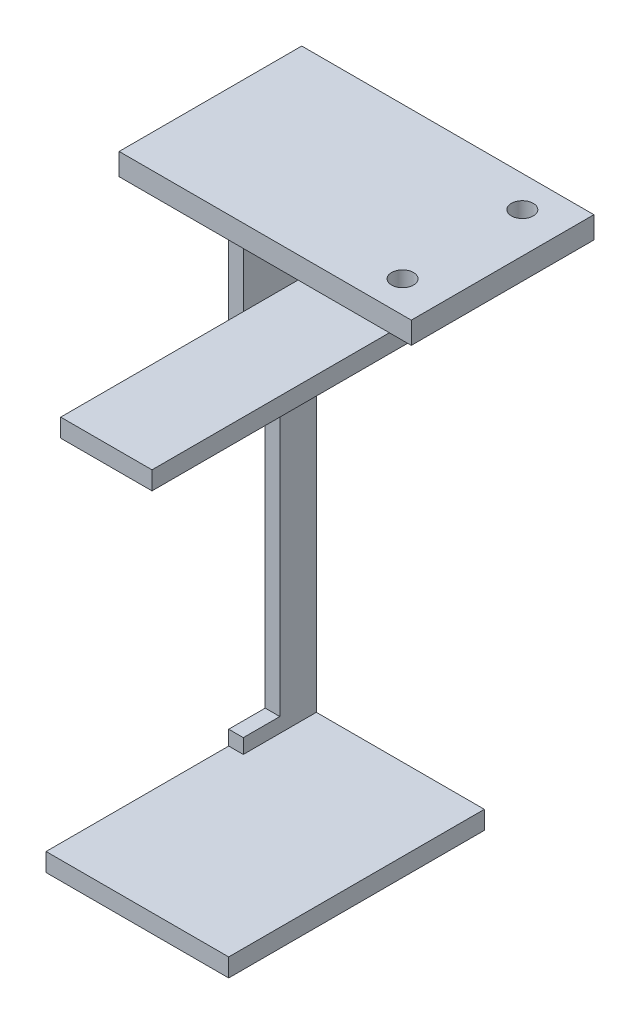
ISO-10303-21;
HEADER;
FILE_DESCRIPTION(('STEP AP214'),'2;1');
FILE_NAME('part.step','',(''),(''),'','','');
FILE_SCHEMA(('AUTOMOTIVE_DESIGN { 1 0 10303 214 1 1 1 1 }'));
ENDSEC;
DATA;
#1=APPLICATION_CONTEXT('core data for automotive mechanical design processes');
#2=APPLICATION_PROTOCOL_DEFINITION('international standard','automotive_design',2000,#1);
#3=PRODUCT_CONTEXT('',#1,'mechanical');
#4=PRODUCT('Part','Part','',(#3));
#5=PRODUCT_RELATED_PRODUCT_CATEGORY('part','',(#4));
#6=PRODUCT_DEFINITION_FORMATION('','',#4);
#7=PRODUCT_DEFINITION_CONTEXT('part definition',#1,'design');
#8=PRODUCT_DEFINITION('design','',#6,#7);
#9=PRODUCT_DEFINITION_SHAPE('','',#8);
#10=(LENGTH_UNIT() NAMED_UNIT(*) SI_UNIT(.MILLI.,.METRE.));
#11=(NAMED_UNIT(*) PLANE_ANGLE_UNIT() SI_UNIT($,.RADIAN.));
#12=(NAMED_UNIT(*) SI_UNIT($,.STERADIAN.) SOLID_ANGLE_UNIT());
#13=UNCERTAINTY_MEASURE_WITH_UNIT(LENGTH_MEASURE(1.E-05),#10,'distance_accuracy_value','');
#14=(GEOMETRIC_REPRESENTATION_CONTEXT(3) GLOBAL_UNCERTAINTY_ASSIGNED_CONTEXT((#13)) GLOBAL_UNIT_ASSIGNED_CONTEXT((#10,
#11,#12)) REPRESENTATION_CONTEXT('',''));
#15=CARTESIAN_POINT('',(0.,0.,0.));
#16=DIRECTION('',(0.,0.,1.));
#17=DIRECTION('',(1.,0.,0.));
#18=AXIS2_PLACEMENT_3D('',#15,#16,#17);
#19=CARTESIAN_POINT('',(-40.,-75.,-15.));
#20=DIRECTION('',(0.,0.,-1.));
#21=DIRECTION('',(-1.,0.,0.));
#22=AXIS2_PLACEMENT_3D('',#19,#20,#21);
#23=PLANE('',#22);
#24=DIRECTION('',(0.,1.,0.));
#25=VECTOR('',#24,1.);
#26=CARTESIAN_POINT('',(-40.,-75.,-15.));
#27=LINE('',#26,#25);
#28=CARTESIAN_POINT('',(-40.,-27.,-15.));
#29=VERTEX_POINT('',#28);
#30=CARTESIAN_POINT('',(-40.,0.,-15.));
#31=VERTEX_POINT('',#30);
#32=EDGE_CURVE('E307',#29,#31,#27,.T.);
#33=ORIENTED_EDGE('',*,*,#32,.F.);
#34=DIRECTION('',(1.,0.,0.));
#35=VECTOR('',#34,1.);
#36=CARTESIAN_POINT('',(-40.,-27.,-15.));
#37=LINE('',#36,#35);
#38=CARTESIAN_POINT('',(-38.,-27.,-15.));
#39=VERTEX_POINT('',#38);
#40=EDGE_CURVE('E213',#29,#39,#37,.T.);
#41=ORIENTED_EDGE('',*,*,#40,.T.);
#42=DIRECTION('',(0.,1.,0.));
#43=VECTOR('',#42,1.);
#44=CARTESIAN_POINT('',(-38.,-75.,-15.));
#45=LINE('',#44,#43);
#46=CARTESIAN_POINT('',(-38.,-25.,-15.));
#47=VERTEX_POINT('',#46);
#48=EDGE_CURVE('E322',#39,#47,#45,.T.);
#49=ORIENTED_EDGE('',*,*,#48,.T.);
#50=CARTESIAN_POINT('',(-38.,-22.5,-15.));
#51=VERTEX_POINT('',#50);
#52=EDGE_CURVE('E323',#47,#51,#45,.T.);
#53=ORIENTED_EDGE('',*,*,#52,.T.);
#54=CARTESIAN_POINT('',(-38.,0.,-15.));
#55=VERTEX_POINT('',#54);
#56=EDGE_CURVE('E316',#51,#55,#45,.T.);
#57=ORIENTED_EDGE('',*,*,#56,.T.);
#58=DIRECTION('',(-1.,0.,0.));
#59=VECTOR('',#58,1.);
#60=CARTESIAN_POINT('',(-40.,0.,-15.));
#61=LINE('',#60,#59);
#62=EDGE_CURVE('E303',#55,#31,#61,.T.);
#63=ORIENTED_EDGE('',*,*,#62,.T.);
#64=EDGE_LOOP('',(#33,#41,#49,#53,#57,#63));
#65=FACE_BOUND('',#64,.T.);
#66=ADVANCED_FACE('F45',(#65),#23,.F.);
#67=CARTESIAN_POINT('',(-38.,-75.,-25.));
#68=DIRECTION('',(-1.,0.,0.));
#69=DIRECTION('',(0.,0.,1.));
#70=AXIS2_PLACEMENT_3D('',#67,#68,#69);
#71=PLANE('',#70);
#72=DIRECTION('',(0.,0.,1.));
#73=VECTOR('',#72,1.);
#74=CARTESIAN_POINT('',(-38.,-22.5,-25.));
#75=LINE('',#74,#73);
#76=CARTESIAN_POINT('',(-38.,-22.5,-25.));
#77=VERTEX_POINT('',#76);
#78=EDGE_CURVE('E69',#77,#51,#75,.T.);
#79=ORIENTED_EDGE('',*,*,#78,.F.);
#80=DIRECTION('',(0.,1.,0.));
#81=VECTOR('',#80,1.);
#82=CARTESIAN_POINT('',(-38.,-75.,-25.));
#83=LINE('',#82,#81);
#84=CARTESIAN_POINT('',(-38.,0.,-25.));
#85=VERTEX_POINT('',#84);
#86=EDGE_CURVE('E321',#77,#85,#83,.T.);
#87=ORIENTED_EDGE('',*,*,#86,.T.);
#88=DIRECTION('',(0.,0.,1.));
#89=VECTOR('',#88,1.);
#90=CARTESIAN_POINT('',(-38.,0.,-25.));
#91=LINE('',#90,#89);
#92=EDGE_CURVE('E297',#85,#55,#91,.T.);
#93=ORIENTED_EDGE('',*,*,#92,.T.);
#94=ORIENTED_EDGE('',*,*,#56,.F.);
#95=EDGE_LOOP('',(#79,#87,#93,#94));
#96=FACE_BOUND('',#95,.T.);
#97=ADVANCED_FACE('F443',(#96),#71,.F.);
#98=ORIENTED_EDGE('',*,*,#48,.F.);
#99=DIRECTION('',(0.,0.,1.));
#100=VECTOR('',#99,1.);
#101=CARTESIAN_POINT('',(-38.,-27.,-15.));
#102=LINE('',#101,#100);
#103=CARTESIAN_POINT('',(-38.,-27.,-20.));
#104=VERTEX_POINT('',#103);
#105=EDGE_CURVE('E201',#104,#39,#102,.T.);
#106=ORIENTED_EDGE('',*,*,#105,.F.);
#107=DIRECTION('',(0.,1.,0.));
#108=VECTOR('',#107,1.);
#109=CARTESIAN_POINT('',(-38.,-27.,-20.));
#110=LINE('',#109,#108);
#111=CARTESIAN_POINT('',(-38.,-73.,-20.));
#112=VERTEX_POINT('',#111);
#113=EDGE_CURVE('E204',#112,#104,#110,.T.);
#114=ORIENTED_EDGE('',*,*,#113,.F.);
#115=DIRECTION('',(0.,0.,-1.));
#116=VECTOR('',#115,1.);
#117=CARTESIAN_POINT('',(-38.,-73.,-20.));
#118=LINE('',#117,#116);
#119=CARTESIAN_POINT('',(-38.,-73.,-15.));
#120=VERTEX_POINT('',#119);
#121=EDGE_CURVE('E179',#120,#112,#118,.T.);
#122=ORIENTED_EDGE('',*,*,#121,.F.);
#123=CARTESIAN_POINT('',(-38.,-75.,-15.));
#124=VERTEX_POINT('',#123);
#125=EDGE_CURVE('E317',#124,#120,#45,.T.);
#126=ORIENTED_EDGE('',*,*,#125,.F.);
#127=DIRECTION('',(0.,0.,1.));
#128=VECTOR('',#127,1.);
#129=CARTESIAN_POINT('',(-38.,-75.,-25.));
#130=LINE('',#129,#128);
#131=CARTESIAN_POINT('',(-38.,-75.,-25.));
#132=VERTEX_POINT('',#131);
#133=EDGE_CURVE('E298',#132,#124,#130,.T.);
#134=ORIENTED_EDGE('',*,*,#133,.F.);
#135=CARTESIAN_POINT('',(-38.,-25.,-25.));
#136=VERTEX_POINT('',#135);
#137=EDGE_CURVE('E324',#132,#136,#83,.T.);
#138=ORIENTED_EDGE('',*,*,#137,.T.);
#139=DIRECTION('',(0.,0.,-1.));
#140=VECTOR('',#139,1.);
#141=CARTESIAN_POINT('',(-38.,-25.,-25.));
#142=LINE('',#141,#140);
#143=EDGE_CURVE('E242',#47,#136,#142,.T.);
#144=ORIENTED_EDGE('',*,*,#143,.F.);
#145=EDGE_LOOP('',(#98,#106,#114,#122,#126,#134,#138,#144));
#146=FACE_BOUND('',#145,.T.);
#147=ADVANCED_FACE('F407',(#146),#71,.F.);
#148=CARTESIAN_POINT('',(0.,0.,0.));
#149=DIRECTION('',(0.,1.,0.));
#150=DIRECTION('',(0.,0.,1.));
#151=AXIS2_PLACEMENT_3D('',#148,#149,#150);
#152=PLANE('',#151);
#153=CARTESIAN_POINT('',(-5.5,0.,-4.3));
#154=DIRECTION('',(0.,1.,0.));
#155=DIRECTION('',(0.,0.,1.));
#156=AXIS2_PLACEMENT_3D('',#153,#154,#155);
#157=CIRCLE('',#156,1.5);
#158=CARTESIAN_POINT('',(-5.5,0.,-2.8));
#159=VERTEX_POINT('',#158);
#160=EDGE_CURVE('E328',#159,#159,#157,.T.);
#161=ORIENTED_EDGE('',*,*,#160,.T.);
#162=EDGE_LOOP('',(#161));
#163=FACE_BOUND('',#162,.T.);
#164=CARTESIAN_POINT('',(-5.5,0.,-20.7));
#165=DIRECTION('',(0.,1.,0.));
#166=DIRECTION('',(0.,0.,1.));
#167=AXIS2_PLACEMENT_3D('',#164,#165,#166);
#168=CIRCLE('',#167,1.5);
#169=CARTESIAN_POINT('',(-5.5,0.,-19.2));
#170=VERTEX_POINT('',#169);
#171=EDGE_CURVE('E333',#170,#170,#168,.T.);
#172=ORIENTED_EDGE('',*,*,#171,.T.);
#173=EDGE_LOOP('',(#172));
#174=FACE_BOUND('',#173,.T.);
#175=ORIENTED_EDGE('',*,*,#62,.F.);
#176=ORIENTED_EDGE('',*,*,#92,.F.);
#177=DIRECTION('',(-1.,0.,0.));
#178=VECTOR('',#177,1.);
#179=CARTESIAN_POINT('',(0.,0.,-25.));
#180=LINE('',#179,#178);
#181=CARTESIAN_POINT('',(0.,0.,-25.));
#182=VERTEX_POINT('',#181);
#183=EDGE_CURVE('E363',#182,#85,#180,.T.);
#184=ORIENTED_EDGE('',*,*,#183,.F.);
#185=DIRECTION('',(0.,0.,-1.));
#186=VECTOR('',#185,1.);
#187=CARTESIAN_POINT('',(0.,0.,0.));
#188=LINE('',#187,#186);
#189=CARTESIAN_POINT('',(0.,0.,0.));
#190=VERTEX_POINT('',#189);
#191=EDGE_CURVE('E341',#190,#182,#188,.T.);
#192=ORIENTED_EDGE('',*,*,#191,.F.);
#193=DIRECTION('',(1.,0.,0.));
#194=VECTOR('',#193,1.);
#195=CARTESIAN_POINT('',(0.,0.,0.));
#196=LINE('',#195,#194);
#197=CARTESIAN_POINT('',(-40.,0.,0.));
#198=VERTEX_POINT('',#197);
#199=EDGE_CURVE('E350',#198,#190,#196,.T.);
#200=ORIENTED_EDGE('',*,*,#199,.F.);
#201=DIRECTION('',(0.,0.,1.));
#202=VECTOR('',#201,1.);
#203=CARTESIAN_POINT('',(-40.,0.,0.));
#204=LINE('',#203,#202);
#205=EDGE_CURVE('E367',#31,#198,#204,.T.);
#206=ORIENTED_EDGE('',*,*,#205,.F.);
#207=EDGE_LOOP('',(#175,#176,#184,#192,#200,#206));
#208=FACE_BOUND('',#207,.T.);
#209=ADVANCED_FACE('F449',(#163,#174,#208),#152,.F.);
#210=CARTESIAN_POINT('',(0.,3.,0.));
#211=DIRECTION('',(0.,1.,0.));
#212=DIRECTION('',(0.,0.,1.));
#213=AXIS2_PLACEMENT_3D('',#210,#211,#212);
#214=PLANE('',#213);
#215=CARTESIAN_POINT('',(-5.5,3.,-20.7));
#216=DIRECTION('',(0.,1.,0.));
#217=DIRECTION('',(0.,0.,1.));
#218=AXIS2_PLACEMENT_3D('',#215,#216,#217);
#219=CIRCLE('',#218,1.5);
#220=CARTESIAN_POINT('',(-5.5,3.,-19.2));
#221=VERTEX_POINT('',#220);
#222=EDGE_CURVE('E337',#221,#221,#219,.T.);
#223=ORIENTED_EDGE('',*,*,#222,.F.);
#224=EDGE_LOOP('',(#223));
#225=FACE_BOUND('',#224,.T.);
#226=DIRECTION('',(0.,0.,-1.));
#227=VECTOR('',#226,1.);
#228=CARTESIAN_POINT('',(0.,3.,0.));
#229=LINE('',#228,#227);
#230=CARTESIAN_POINT('',(0.,3.,0.));
#231=VERTEX_POINT('',#230);
#232=CARTESIAN_POINT('',(0.,3.,-25.));
#233=VERTEX_POINT('',#232);
#234=EDGE_CURVE('E345',#231,#233,#229,.T.);
#235=ORIENTED_EDGE('',*,*,#234,.T.);
#236=DIRECTION('',(-1.,0.,0.));
#237=VECTOR('',#236,1.);
#238=CARTESIAN_POINT('',(0.,3.,-25.));
#239=LINE('',#238,#237);
#240=CARTESIAN_POINT('',(-40.,3.,-25.));
#241=VERTEX_POINT('',#240);
#242=EDGE_CURVE('E349',#233,#241,#239,.T.);
#243=ORIENTED_EDGE('',*,*,#242,.T.);
#244=DIRECTION('',(0.,0.,1.));
#245=VECTOR('',#244,1.);
#246=CARTESIAN_POINT('',(-40.,3.,0.));
#247=LINE('',#246,#245);
#248=CARTESIAN_POINT('',(-40.,3.,0.));
#249=VERTEX_POINT('',#248);
#250=EDGE_CURVE('E353',#241,#249,#247,.T.);
#251=ORIENTED_EDGE('',*,*,#250,.T.);
#252=DIRECTION('',(1.,0.,0.));
#253=VECTOR('',#252,1.);
#254=CARTESIAN_POINT('',(0.,3.,0.));
#255=LINE('',#254,#253);
#256=EDGE_CURVE('E356',#249,#231,#255,.T.);
#257=ORIENTED_EDGE('',*,*,#256,.T.);
#258=EDGE_LOOP('',(#235,#243,#251,#257));
#259=FACE_BOUND('',#258,.T.);
#260=CARTESIAN_POINT('',(-5.5,3.,-4.3));
#261=DIRECTION('',(0.,1.,0.));
#262=DIRECTION('',(0.,0.,1.));
#263=AXIS2_PLACEMENT_3D('',#260,#261,#262);
#264=CIRCLE('',#263,1.5);
#265=CARTESIAN_POINT('',(-5.5,3.,-2.8));
#266=VERTEX_POINT('',#265);
#267=EDGE_CURVE('E329',#266,#266,#264,.T.);
#268=ORIENTED_EDGE('',*,*,#267,.F.);
#269=EDGE_LOOP('',(#268));
#270=FACE_BOUND('',#269,.T.);
#271=ADVANCED_FACE('F458',(#225,#259,#270),#214,.T.);
#272=CARTESIAN_POINT('',(0.,3.,0.));
#273=DIRECTION('',(-1.,0.,0.));
#274=DIRECTION('',(0.,0.,1.));
#275=AXIS2_PLACEMENT_3D('',#272,#273,#274);
#276=PLANE('',#275);
#277=ORIENTED_EDGE('',*,*,#191,.T.);
#278=DIRECTION('',(0.,-1.,0.));
#279=VECTOR('',#278,1.);
#280=CARTESIAN_POINT('',(0.,3.,-25.));
#281=LINE('',#280,#279);
#282=EDGE_CURVE('E11',#233,#182,#281,.T.);
#283=ORIENTED_EDGE('',*,*,#282,.F.);
#284=ORIENTED_EDGE('',*,*,#234,.F.);
#285=DIRECTION('',(0.,-1.,0.));
#286=VECTOR('',#285,1.);
#287=CARTESIAN_POINT('',(0.,3.,0.));
#288=LINE('',#287,#286);
#289=EDGE_CURVE('E359',#231,#190,#288,.T.);
#290=ORIENTED_EDGE('',*,*,#289,.T.);
#291=EDGE_LOOP('',(#277,#283,#284,#290));
#292=FACE_BOUND('',#291,.T.);
#293=ADVANCED_FACE('F47',(#292),#276,.F.);
#294=CARTESIAN_POINT('',(0.,3.,-25.));
#295=DIRECTION('',(0.,0.,1.));
#296=DIRECTION('',(1.,0.,0.));
#297=AXIS2_PLACEMENT_3D('',#294,#295,#296);
#298=PLANE('',#297);
#299=ORIENTED_EDGE('',*,*,#183,.T.);
#300=ORIENTED_EDGE('',*,*,#86,.F.);
#301=DIRECTION('',(-1.,0.,0.));
#302=VECTOR('',#301,1.);
#303=CARTESIAN_POINT('',(-25.5,-22.5,-25.));
#304=LINE('',#303,#302);
#305=CARTESIAN_POINT('',(-25.5,-22.5,-25.));
#306=VERTEX_POINT('',#305);
#307=EDGE_CURVE('E257',#306,#77,#304,.T.);
#308=ORIENTED_EDGE('',*,*,#307,.F.);
#309=DIRECTION('',(0.,1.,0.));
#310=VECTOR('',#309,1.);
#311=CARTESIAN_POINT('',(-25.5,-25.,-25.));
#312=LINE('',#311,#310);
#313=CARTESIAN_POINT('',(-25.5,-25.,-25.));
#314=VERTEX_POINT('',#313);
#315=EDGE_CURVE('E222',#314,#306,#312,.T.);
#316=ORIENTED_EDGE('',*,*,#315,.F.);
#317=DIRECTION('',(-1.,0.,0.));
#318=VECTOR('',#317,1.);
#319=CARTESIAN_POINT('',(-25.5,-25.,-25.));
#320=LINE('',#319,#318);
#321=EDGE_CURVE('E236',#314,#136,#320,.T.);
#322=ORIENTED_EDGE('',*,*,#321,.T.);
#323=ORIENTED_EDGE('',*,*,#137,.F.);
#324=DIRECTION('',(1.,0.,0.));
#325=VECTOR('',#324,1.);
#326=CARTESIAN_POINT('',(-40.,-75.,-25.));
#327=LINE('',#326,#325);
#328=CARTESIAN_POINT('',(-15.,-75.,-25.));
#329=VERTEX_POINT('',#328);
#330=EDGE_CURVE('E278',#132,#329,#327,.T.);
#331=ORIENTED_EDGE('',*,*,#330,.T.);
#332=DIRECTION('',(0.,1.,0.));
#333=VECTOR('',#332,1.);
#334=CARTESIAN_POINT('',(-15.,-77.5,-25.));
#335=LINE('',#334,#333);
#336=CARTESIAN_POINT('',(-15.,-77.5,-25.));
#337=VERTEX_POINT('',#336);
#338=EDGE_CURVE('E293',#337,#329,#335,.T.);
#339=ORIENTED_EDGE('',*,*,#338,.F.);
#340=DIRECTION('',(1.,0.,0.));
#341=VECTOR('',#340,1.);
#342=CARTESIAN_POINT('',(-40.,-77.5,-25.));
#343=LINE('',#342,#341);
#344=CARTESIAN_POINT('',(-40.,-77.5,-25.));
#345=VERTEX_POINT('',#344);
#346=EDGE_CURVE('E265',#345,#337,#343,.T.);
#347=ORIENTED_EDGE('',*,*,#346,.F.);
#348=DIRECTION('',(0.,-1.,0.));
#349=VECTOR('',#348,1.);
#350=CARTESIAN_POINT('',(-40.,3.,-25.));
#351=LINE('',#350,#349);
#352=EDGE_CURVE('E54',#241,#345,#351,.T.);
#353=ORIENTED_EDGE('',*,*,#352,.F.);
#354=ORIENTED_EDGE('',*,*,#242,.F.);
#355=ORIENTED_EDGE('',*,*,#282,.T.);
#356=EDGE_LOOP('',(#299,#300,#308,#316,#322,#323,#331,#339,#347,#353,#354,#355));
#357=FACE_BOUND('',#356,.T.);
#358=ADVANCED_FACE('F386',(#357),#298,.F.);
#359=CARTESIAN_POINT('',(-40.,3.,0.));
#360=DIRECTION('',(1.,0.,0.));
#361=DIRECTION('',(0.,0.,-1.));
#362=AXIS2_PLACEMENT_3D('',#359,#360,#361);
#363=PLANE('',#362);
#364=DIRECTION('',(0.,1.,0.));
#365=VECTOR('',#364,1.);
#366=CARTESIAN_POINT('',(-40.,-27.,-20.));
#367=LINE('',#366,#365);
#368=CARTESIAN_POINT('',(-40.,-73.,-20.));
#369=VERTEX_POINT('',#368);
#370=CARTESIAN_POINT('',(-40.,-27.,-20.));
#371=VERTEX_POINT('',#370);
#372=EDGE_CURVE('E188',#369,#371,#367,.T.);
#373=ORIENTED_EDGE('',*,*,#372,.T.);
#374=DIRECTION('',(0.,0.,1.));
#375=VECTOR('',#374,1.);
#376=CARTESIAN_POINT('',(-40.,-27.,-15.));
#377=LINE('',#376,#375);
#378=EDGE_CURVE('E194',#371,#29,#377,.T.);
#379=ORIENTED_EDGE('',*,*,#378,.T.);
#380=ORIENTED_EDGE('',*,*,#32,.T.);
#381=ORIENTED_EDGE('',*,*,#205,.T.);
#382=DIRECTION('',(0.,-1.,0.));
#383=VECTOR('',#382,1.);
#384=CARTESIAN_POINT('',(-40.,3.,0.));
#385=LINE('',#384,#383);
#386=EDGE_CURVE('E375',#249,#198,#385,.T.);
#387=ORIENTED_EDGE('',*,*,#386,.F.);
#388=ORIENTED_EDGE('',*,*,#250,.F.);
#389=ORIENTED_EDGE('',*,*,#352,.T.);
#390=DIRECTION('',(0.,0.,-1.));
#391=VECTOR('',#390,1.);
#392=CARTESIAN_POINT('',(-40.,-77.5,-25.));
#393=LINE('',#392,#391);
#394=CARTESIAN_POINT('',(-40.,-77.5,10.));
#395=VERTEX_POINT('',#394);
#396=EDGE_CURVE('E261',#395,#345,#393,.T.);
#397=ORIENTED_EDGE('',*,*,#396,.F.);
#398=DIRECTION('',(0.,1.,0.));
#399=VECTOR('',#398,1.);
#400=CARTESIAN_POINT('',(-40.,-77.5,10.));
#401=LINE('',#400,#399);
#402=CARTESIAN_POINT('',(-40.,-75.,10.));
#403=VERTEX_POINT('',#402);
#404=EDGE_CURVE('E275',#395,#403,#401,.T.);
#405=ORIENTED_EDGE('',*,*,#404,.T.);
#406=DIRECTION('',(0.,0.,-1.));
#407=VECTOR('',#406,1.);
#408=CARTESIAN_POINT('',(-40.,-75.,-25.));
#409=LINE('',#408,#407);
#410=CARTESIAN_POINT('',(-40.,-75.,-15.));
#411=VERTEX_POINT('',#410);
#412=EDGE_CURVE('E260',#403,#411,#409,.T.);
#413=ORIENTED_EDGE('',*,*,#412,.T.);
#414=CARTESIAN_POINT('',(-40.,-73.,-15.));
#415=VERTEX_POINT('',#414);
#416=EDGE_CURVE('E199',#411,#415,#27,.T.);
#417=ORIENTED_EDGE('',*,*,#416,.T.);
#418=DIRECTION('',(0.,0.,-1.));
#419=VECTOR('',#418,1.);
#420=CARTESIAN_POINT('',(-40.,-73.,-20.));
#421=LINE('',#420,#419);
#422=EDGE_CURVE('E61',#415,#369,#421,.T.);
#423=ORIENTED_EDGE('',*,*,#422,.T.);
#424=EDGE_LOOP('',(#373,#379,#380,#381,#387,#388,#389,#397,#405,#413,#417,#423));
#425=FACE_BOUND('',#424,.T.);
#426=ADVANCED_FACE('F197',(#425),#363,.F.);
#427=CARTESIAN_POINT('',(0.,3.,0.));
#428=DIRECTION('',(0.,0.,-1.));
#429=DIRECTION('',(-1.,0.,0.));
#430=AXIS2_PLACEMENT_3D('',#427,#428,#429);
#431=PLANE('',#430);
#432=ORIENTED_EDGE('',*,*,#199,.T.);
#433=ORIENTED_EDGE('',*,*,#289,.F.);
#434=ORIENTED_EDGE('',*,*,#256,.F.);
#435=ORIENTED_EDGE('',*,*,#386,.T.);
#436=EDGE_LOOP('',(#432,#433,#434,#435));
#437=FACE_BOUND('',#436,.T.);
#438=ADVANCED_FACE('F454',(#437),#431,.F.);
#439=CARTESIAN_POINT('',(-5.5,3.,-20.7));
#440=DIRECTION('',(0.,-1.,0.));
#441=DIRECTION('',(0.,0.,-1.));
#442=AXIS2_PLACEMENT_3D('',#439,#440,#441);
#443=CYLINDRICAL_SURFACE('',#442,1.5);
#444=ORIENTED_EDGE('',*,*,#222,.T.);
#445=EDGE_LOOP('',(#444));
#446=FACE_BOUND('',#445,.T.);
#447=ORIENTED_EDGE('',*,*,#171,.F.);
#448=EDGE_LOOP('',(#447));
#449=FACE_BOUND('',#448,.T.);
#450=ADVANCED_FACE('F489',(#446,#449),#443,.F.);
#451=CARTESIAN_POINT('',(-5.5,3.,-4.3));
#452=DIRECTION('',(0.,-1.,0.));
#453=DIRECTION('',(0.,0.,-1.));
#454=AXIS2_PLACEMENT_3D('',#451,#452,#453);
#455=CYLINDRICAL_SURFACE('',#454,1.5);
#456=ORIENTED_EDGE('',*,*,#267,.T.);
#457=EDGE_LOOP('',(#456));
#458=FACE_BOUND('',#457,.T.);
#459=ORIENTED_EDGE('',*,*,#160,.F.);
#460=EDGE_LOOP('',(#459));
#461=FACE_BOUND('',#460,.T.);
#462=ADVANCED_FACE('F481',(#458,#461),#455,.F.);
#463=ORIENTED_EDGE('',*,*,#125,.T.);
#464=DIRECTION('',(1.,0.,0.));
#465=VECTOR('',#464,1.);
#466=CARTESIAN_POINT('',(-40.,-73.,-15.));
#467=LINE('',#466,#465);
#468=EDGE_CURVE('E185',#415,#120,#467,.T.);
#469=ORIENTED_EDGE('',*,*,#468,.F.);
#470=ORIENTED_EDGE('',*,*,#416,.F.);
#471=DIRECTION('',(-1.,0.,0.));
#472=VECTOR('',#471,1.);
#473=CARTESIAN_POINT('',(-40.,-75.,-15.));
#474=LINE('',#473,#472);
#475=EDGE_CURVE('E302',#124,#411,#474,.T.);
#476=ORIENTED_EDGE('',*,*,#475,.F.);
#477=EDGE_LOOP('',(#463,#469,#470,#476));
#478=FACE_BOUND('',#477,.T.);
#479=ADVANCED_FACE('F404',(#478),#23,.F.);
#480=CARTESIAN_POINT('',(-15.,-77.5,-25.));
#481=DIRECTION('',(-1.,0.,0.));
#482=DIRECTION('',(0.,0.,1.));
#483=AXIS2_PLACEMENT_3D('',#480,#481,#482);
#484=PLANE('',#483);
#485=DIRECTION('',(0.,0.,1.));
#486=VECTOR('',#485,1.);
#487=CARTESIAN_POINT('',(-15.,-75.,-25.));
#488=LINE('',#487,#486);
#489=CARTESIAN_POINT('',(-15.,-75.,10.));
#490=VERTEX_POINT('',#489);
#491=EDGE_CURVE('E281',#329,#490,#488,.T.);
#492=ORIENTED_EDGE('',*,*,#491,.T.);
#493=DIRECTION('',(0.,1.,0.));
#494=VECTOR('',#493,1.);
#495=CARTESIAN_POINT('',(-15.,-77.5,10.));
#496=LINE('',#495,#494);
#497=CARTESIAN_POINT('',(-15.,-77.5,10.));
#498=VERTEX_POINT('',#497);
#499=EDGE_CURVE('E289',#498,#490,#496,.T.);
#500=ORIENTED_EDGE('',*,*,#499,.F.);
#501=DIRECTION('',(0.,0.,1.));
#502=VECTOR('',#501,1.);
#503=CARTESIAN_POINT('',(-15.,-77.5,-25.));
#504=LINE('',#503,#502);
#505=EDGE_CURVE('E269',#337,#498,#504,.T.);
#506=ORIENTED_EDGE('',*,*,#505,.F.);
#507=ORIENTED_EDGE('',*,*,#338,.T.);
#508=EDGE_LOOP('',(#492,#500,#506,#507));
#509=FACE_BOUND('',#508,.T.);
#510=ADVANCED_FACE('F480',(#509),#484,.F.);
#511=CARTESIAN_POINT('',(-40.,-77.5,10.));
#512=DIRECTION('',(0.,0.,-1.));
#513=DIRECTION('',(-1.,0.,0.));
#514=AXIS2_PLACEMENT_3D('',#511,#512,#513);
#515=PLANE('',#514);
#516=DIRECTION('',(-1.,0.,0.));
#517=VECTOR('',#516,1.);
#518=CARTESIAN_POINT('',(-40.,-75.,10.));
#519=LINE('',#518,#517);
#520=EDGE_CURVE('E266',#490,#403,#519,.T.);
#521=ORIENTED_EDGE('',*,*,#520,.T.);
#522=ORIENTED_EDGE('',*,*,#404,.F.);
#523=DIRECTION('',(-1.,0.,0.));
#524=VECTOR('',#523,1.);
#525=CARTESIAN_POINT('',(-40.,-77.5,10.));
#526=LINE('',#525,#524);
#527=EDGE_CURVE('E272',#498,#395,#526,.T.);
#528=ORIENTED_EDGE('',*,*,#527,.F.);
#529=ORIENTED_EDGE('',*,*,#499,.T.);
#530=EDGE_LOOP('',(#521,#522,#528,#529));
#531=FACE_BOUND('',#530,.T.);
#532=ADVANCED_FACE('F394',(#531),#515,.F.);
#533=CARTESIAN_POINT('',(0.,-77.5,0.));
#534=DIRECTION('',(0.,1.,0.));
#535=DIRECTION('',(0.,0.,1.));
#536=AXIS2_PLACEMENT_3D('',#533,#534,#535);
#537=PLANE('',#536);
#538=ORIENTED_EDGE('',*,*,#396,.T.);
#539=ORIENTED_EDGE('',*,*,#346,.T.);
#540=ORIENTED_EDGE('',*,*,#505,.T.);
#541=ORIENTED_EDGE('',*,*,#527,.T.);
#542=EDGE_LOOP('',(#538,#539,#540,#541));
#543=FACE_BOUND('',#542,.T.);
#544=ADVANCED_FACE('F389',(#543),#537,.F.);
#545=CARTESIAN_POINT('',(0.,-75.,0.));
#546=DIRECTION('',(0.,1.,0.));
#547=DIRECTION('',(0.,0.,1.));
#548=AXIS2_PLACEMENT_3D('',#545,#546,#547);
#549=PLANE('',#548);
#550=ORIENTED_EDGE('',*,*,#330,.F.);
#551=ORIENTED_EDGE('',*,*,#133,.T.);
#552=ORIENTED_EDGE('',*,*,#475,.T.);
#553=ORIENTED_EDGE('',*,*,#412,.F.);
#554=ORIENTED_EDGE('',*,*,#520,.F.);
#555=ORIENTED_EDGE('',*,*,#491,.F.);
#556=EDGE_LOOP('',(#550,#551,#552,#553,#554,#555));
#557=FACE_BOUND('',#556,.T.);
#558=ADVANCED_FACE('F399',(#557),#549,.T.);
#559=CARTESIAN_POINT('',(-38.,0.,0.));
#560=DIRECTION('',(1.,0.,0.));
#561=DIRECTION('',(0.,0.,-1.));
#562=AXIS2_PLACEMENT_3D('',#559,#560,#561);
#563=PLANE('',#562);
#564=CARTESIAN_POINT('',(-38.,-22.5,10.));
#565=VERTEX_POINT('',#564);
#566=EDGE_CURVE('E217',#51,#565,#75,.T.);
#567=ORIENTED_EDGE('',*,*,#566,.F.);
#568=ORIENTED_EDGE('',*,*,#52,.F.);
#569=CARTESIAN_POINT('',(-38.,-25.,10.));
#570=VERTEX_POINT('',#569);
#571=EDGE_CURVE('E227',#570,#47,#142,.T.);
#572=ORIENTED_EDGE('',*,*,#571,.F.);
#573=DIRECTION('',(0.,-1.,0.));
#574=VECTOR('',#573,1.);
#575=CARTESIAN_POINT('',(-38.,-25.,10.));
#576=LINE('',#575,#574);
#577=EDGE_CURVE('E239',#565,#570,#576,.T.);
#578=ORIENTED_EDGE('',*,*,#577,.F.);
#579=EDGE_LOOP('',(#567,#568,#572,#578));
#580=FACE_BOUND('',#579,.T.);
#581=ADVANCED_FACE('F432',(#580),#563,.F.);
#582=CARTESIAN_POINT('',(-25.5,-22.5,-25.));
#583=DIRECTION('',(0.,-1.,0.));
#584=DIRECTION('',(0.,0.,-1.));
#585=AXIS2_PLACEMENT_3D('',#582,#583,#584);
#586=PLANE('',#585);
#587=ORIENTED_EDGE('',*,*,#78,.T.);
#588=ORIENTED_EDGE('',*,*,#566,.T.);
#589=DIRECTION('',(-1.,0.,0.));
#590=VECTOR('',#589,1.);
#591=CARTESIAN_POINT('',(-25.5,-22.5,10.));
#592=LINE('',#591,#590);
#593=CARTESIAN_POINT('',(-25.5,-22.5,10.));
#594=VERTEX_POINT('',#593);
#595=EDGE_CURVE('E253',#594,#565,#592,.T.);
#596=ORIENTED_EDGE('',*,*,#595,.F.);
#597=DIRECTION('',(0.,0.,1.));
#598=VECTOR('',#597,1.);
#599=CARTESIAN_POINT('',(-25.5,-22.5,-25.));
#600=LINE('',#599,#598);
#601=EDGE_CURVE('E226',#306,#594,#600,.T.);
#602=ORIENTED_EDGE('',*,*,#601,.F.);
#603=ORIENTED_EDGE('',*,*,#307,.T.);
#604=EDGE_LOOP('',(#587,#588,#596,#602,#603));
#605=FACE_BOUND('',#604,.T.);
#606=ADVANCED_FACE('F423',(#605),#586,.F.);
#607=CARTESIAN_POINT('',(-25.5,-25.,10.));
#608=DIRECTION('',(0.,0.,-1.));
#609=DIRECTION('',(0.,1.,0.));
#610=AXIS2_PLACEMENT_3D('',#607,#608,#609);
#611=PLANE('',#610);
#612=ORIENTED_EDGE('',*,*,#577,.T.);
#613=DIRECTION('',(-1.,0.,0.));
#614=VECTOR('',#613,1.);
#615=CARTESIAN_POINT('',(-25.5,-25.,10.));
#616=LINE('',#615,#614);
#617=CARTESIAN_POINT('',(-25.5,-25.,10.));
#618=VERTEX_POINT('',#617);
#619=EDGE_CURVE('E249',#618,#570,#616,.T.);
#620=ORIENTED_EDGE('',*,*,#619,.F.);
#621=DIRECTION('',(0.,-1.,0.));
#622=VECTOR('',#621,1.);
#623=CARTESIAN_POINT('',(-25.5,-25.,10.));
#624=LINE('',#623,#622);
#625=EDGE_CURVE('E230',#594,#618,#624,.T.);
#626=ORIENTED_EDGE('',*,*,#625,.F.);
#627=ORIENTED_EDGE('',*,*,#595,.T.);
#628=EDGE_LOOP('',(#612,#620,#626,#627));
#629=FACE_BOUND('',#628,.T.);
#630=ADVANCED_FACE('F429',(#629),#611,.F.);
#631=CARTESIAN_POINT('',(-25.5,-25.,-25.));
#632=DIRECTION('',(0.,1.,0.));
#633=DIRECTION('',(0.,0.,1.));
#634=AXIS2_PLACEMENT_3D('',#631,#632,#633);
#635=PLANE('',#634);
#636=ORIENTED_EDGE('',*,*,#571,.T.);
#637=ORIENTED_EDGE('',*,*,#143,.T.);
#638=ORIENTED_EDGE('',*,*,#321,.F.);
#639=DIRECTION('',(0.,0.,-1.));
#640=VECTOR('',#639,1.);
#641=CARTESIAN_POINT('',(-25.5,-25.,-25.));
#642=LINE('',#641,#640);
#643=EDGE_CURVE('E233',#618,#314,#642,.T.);
#644=ORIENTED_EDGE('',*,*,#643,.F.);
#645=ORIENTED_EDGE('',*,*,#619,.T.);
#646=EDGE_LOOP('',(#636,#637,#638,#644,#645));
#647=FACE_BOUND('',#646,.T.);
#648=ADVANCED_FACE('F434',(#647),#635,.F.);
#649=CARTESIAN_POINT('',(-25.5,0.,0.));
#650=DIRECTION('',(1.,0.,0.));
#651=DIRECTION('',(0.,0.,-1.));
#652=AXIS2_PLACEMENT_3D('',#649,#650,#651);
#653=PLANE('',#652);
#654=ORIENTED_EDGE('',*,*,#315,.T.);
#655=ORIENTED_EDGE('',*,*,#601,.T.);
#656=ORIENTED_EDGE('',*,*,#625,.T.);
#657=ORIENTED_EDGE('',*,*,#643,.T.);
#658=EDGE_LOOP('',(#654,#655,#656,#657));
#659=FACE_BOUND('',#658,.T.);
#660=ADVANCED_FACE('F440',(#659),#653,.T.);
#661=CARTESIAN_POINT('',(-40.,-27.,-15.));
#662=DIRECTION('',(0.,1.,0.));
#663=DIRECTION('',(0.,0.,1.));
#664=AXIS2_PLACEMENT_3D('',#661,#662,#663);
#665=PLANE('',#664);
#666=ORIENTED_EDGE('',*,*,#105,.T.);
#667=ORIENTED_EDGE('',*,*,#40,.F.);
#668=ORIENTED_EDGE('',*,*,#378,.F.);
#669=DIRECTION('',(1.,0.,0.));
#670=VECTOR('',#669,1.);
#671=CARTESIAN_POINT('',(-40.,-27.,-20.));
#672=LINE('',#671,#670);
#673=EDGE_CURVE('E184',#371,#104,#672,.T.);
#674=ORIENTED_EDGE('',*,*,#673,.T.);
#675=EDGE_LOOP('',(#666,#667,#668,#674));
#676=FACE_BOUND('',#675,.T.);
#677=ADVANCED_FACE('F411',(#676),#665,.F.);
#678=CARTESIAN_POINT('',(-40.,-27.,-20.));
#679=DIRECTION('',(0.,0.,-1.));
#680=DIRECTION('',(0.,1.,0.));
#681=AXIS2_PLACEMENT_3D('',#678,#679,#680);
#682=PLANE('',#681);
#683=ORIENTED_EDGE('',*,*,#113,.T.);
#684=ORIENTED_EDGE('',*,*,#673,.F.);
#685=ORIENTED_EDGE('',*,*,#372,.F.);
#686=DIRECTION('',(1.,0.,0.));
#687=VECTOR('',#686,1.);
#688=CARTESIAN_POINT('',(-40.,-73.,-20.));
#689=LINE('',#688,#687);
#690=EDGE_CURVE('E175',#369,#112,#689,.T.);
#691=ORIENTED_EDGE('',*,*,#690,.T.);
#692=EDGE_LOOP('',(#683,#684,#685,#691));
#693=FACE_BOUND('',#692,.T.);
#694=ADVANCED_FACE('F189',(#693),#682,.F.);
#695=CARTESIAN_POINT('',(-40.,-73.,-20.));
#696=DIRECTION('',(0.,-1.,0.));
#697=DIRECTION('',(0.,0.,-1.));
#698=AXIS2_PLACEMENT_3D('',#695,#696,#697);
#699=PLANE('',#698);
#700=ORIENTED_EDGE('',*,*,#121,.T.);
#701=ORIENTED_EDGE('',*,*,#690,.F.);
#702=ORIENTED_EDGE('',*,*,#422,.F.);
#703=ORIENTED_EDGE('',*,*,#468,.T.);
#704=EDGE_LOOP('',(#700,#701,#702,#703));
#705=FACE_BOUND('',#704,.T.);
#706=ADVANCED_FACE('F177',(#705),#699,.F.);
#707=CLOSED_SHELL('',(#66,#97,#147,#209,#271,#293,#358,#426,#438,#450,#462,#479,#510,#532,#544,
#558,#581,#606,#630,#648,#660,#677,#694,#706));
#708=MANIFOLD_SOLID_BREP('B2',#707);
#709=ADVANCED_BREP_SHAPE_REPRESENTATION('',(#18,#708),#14);
#710=SHAPE_DEFINITION_REPRESENTATION(#9,#709);
ENDSEC;
END-ISO-10303-21;
